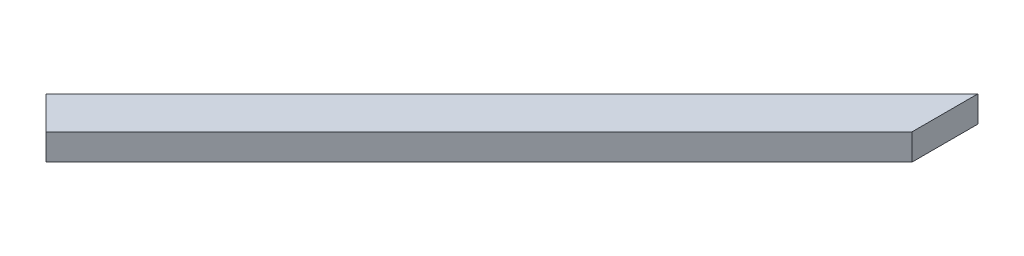
ISO-10303-21;
HEADER;
FILE_DESCRIPTION(('STEP AP214'),'2;1');
FILE_NAME('part.step','',(''),(''),'','','');
FILE_SCHEMA(('AUTOMOTIVE_DESIGN { 1 0 10303 214 1 1 1 1 }'));
ENDSEC;
DATA;
#1=APPLICATION_CONTEXT('core data for automotive mechanical design processes');
#2=APPLICATION_PROTOCOL_DEFINITION('international standard','automotive_design',2000,#1);
#3=PRODUCT_CONTEXT('',#1,'mechanical');
#4=PRODUCT('Part','Part','',(#3));
#5=PRODUCT_RELATED_PRODUCT_CATEGORY('part','',(#4));
#6=PRODUCT_DEFINITION_FORMATION('','',#4);
#7=PRODUCT_DEFINITION_CONTEXT('part definition',#1,'design');
#8=PRODUCT_DEFINITION('design','',#6,#7);
#9=PRODUCT_DEFINITION_SHAPE('','',#8);
#10=(LENGTH_UNIT() NAMED_UNIT(*) SI_UNIT(.MILLI.,.METRE.));
#11=(NAMED_UNIT(*) PLANE_ANGLE_UNIT() SI_UNIT($,.RADIAN.));
#12=(NAMED_UNIT(*) SI_UNIT($,.STERADIAN.) SOLID_ANGLE_UNIT());
#13=UNCERTAINTY_MEASURE_WITH_UNIT(LENGTH_MEASURE(1.E-05),#10,'distance_accuracy_value','');
#14=(GEOMETRIC_REPRESENTATION_CONTEXT(3) GLOBAL_UNCERTAINTY_ASSIGNED_CONTEXT((#13)) GLOBAL_UNIT_ASSIGNED_CONTEXT((#10,
#11,#12)) REPRESENTATION_CONTEXT('',''));
#15=CARTESIAN_POINT('',(0.,0.,0.));
#16=DIRECTION('',(0.,0.,1.));
#17=DIRECTION('',(1.,0.,0.));
#18=AXIS2_PLACEMENT_3D('',#15,#16,#17);
#19=CARTESIAN_POINT('',(-35.1155,0.,35.1155000000002));
#20=DIRECTION('',(-1.,0.,0.));
#21=DIRECTION('',(0.,0.,1.));
#22=AXIS2_PLACEMENT_3D('',#19,#20,#21);
#23=PLANE('',#22);
#24=DIRECTION('',(0.,1.,0.));
#25=VECTOR('',#24,1.);
#26=CARTESIAN_POINT('',(-35.1155,29.2099999999996,35.1155));
#27=LINE('',#26,#25);
#28=CARTESIAN_POINT('',(-35.1155,0.,35.1155000000002));
#29=VERTEX_POINT('',#28);
#30=CARTESIAN_POINT('',(-35.1155,4.572,35.1155000000001));
#31=VERTEX_POINT('',#30);
#32=EDGE_CURVE('E89',#29,#31,#27,.T.);
#33=ORIENTED_EDGE('',*,*,#32,.T.);
#34=DIRECTION('',(0.,0.,1.));
#35=VECTOR('',#34,1.);
#36=CARTESIAN_POINT('',(-35.1155,4.572,149.86));
#37=LINE('',#36,#35);
#38=CARTESIAN_POINT('',(-35.1155,4.572,46.6461488594529));
#39=VERTEX_POINT('',#38);
#40=EDGE_CURVE('E84',#31,#39,#37,.T.);
#41=ORIENTED_EDGE('',*,*,#40,.T.);
#42=DIRECTION('',(0.,-1.,0.));
#43=VECTOR('',#42,1.);
#44=CARTESIAN_POINT('',(-35.1155,29.2100000000002,46.6461488594529));
#45=LINE('',#44,#43);
#46=CARTESIAN_POINT('',(-35.1155,0.,46.6461488594529));
#47=VERTEX_POINT('',#46);
#48=EDGE_CURVE('E41',#39,#47,#45,.T.);
#49=ORIENTED_EDGE('',*,*,#48,.T.);
#50=DIRECTION('',(0.,0.,-1.));
#51=VECTOR('',#50,1.);
#52=CARTESIAN_POINT('',(-35.1155,0.,-136.622759184095));
#53=LINE('',#52,#51);
#54=EDGE_CURVE('E79',#47,#29,#53,.T.);
#55=ORIENTED_EDGE('',*,*,#54,.T.);
#56=EDGE_LOOP('',(#33,#41,#49,#55));
#57=FACE_BOUND('',#56,.T.);
#58=ADVANCED_FACE('F37',(#57),#23,.F.);
#59=CARTESIAN_POINT('',(-60.3181446143553,0.,-136.622759184095));
#60=DIRECTION('',(0.,-1.,0.));
#61=DIRECTION('',(0.,0.,-1.));
#62=AXIS2_PLACEMENT_3D('',#59,#60,#61);
#63=PLANE('',#62);
#64=ORIENTED_EDGE('',*,*,#54,.F.);
#65=DIRECTION('',(-0.707106781186546,0.,0.707106781186549));
#66=VECTOR('',#65,1.);
#67=CARTESIAN_POINT('',(-16.89356433676,0.,28.4242131962128));
#68=LINE('',#67,#66);
#69=CARTESIAN_POINT('',(-110.557635679511,0.,122.088284538964));
#70=VERTEX_POINT('',#69);
#71=EDGE_CURVE('E61',#47,#70,#68,.T.);
#72=ORIENTED_EDGE('',*,*,#71,.T.);
#73=DIRECTION('',(0.707106781186549,0.,0.707106781186546));
#74=VECTOR('',#73,1.);
#75=CARTESIAN_POINT('',(-116.322960109237,0.,116.322960109238));
#76=LINE('',#75,#74);
#77=CARTESIAN_POINT('',(-116.322960109237,0.,116.322960109238));
#78=VERTEX_POINT('',#77);
#79=EDGE_CURVE('E46',#78,#70,#76,.T.);
#80=ORIENTED_EDGE('',*,*,#79,.F.);
#81=DIRECTION('',(-0.707106781186546,0.,0.707106781186549));
#82=VECTOR('',#81,1.);
#83=CARTESIAN_POINT('',(-22.6588887664864,0.,22.6588887664865));
#84=LINE('',#83,#82);
#85=EDGE_CURVE('E54',#29,#78,#84,.T.);
#86=ORIENTED_EDGE('',*,*,#85,.F.);
#87=EDGE_LOOP('',(#64,#72,#80,#86));
#88=FACE_BOUND('',#87,.T.);
#89=ADVANCED_FACE('F39',(#88),#63,.T.);
#90=CARTESIAN_POINT('',(-116.322960109237,0.,116.322960109238));
#91=DIRECTION('',(0.707106781186546,0.,-0.707106781186549));
#92=DIRECTION('',(-0.707106781186549,0.,-0.707106781186546));
#93=AXIS2_PLACEMENT_3D('',#90,#91,#92);
#94=PLANE('',#93);
#95=DIRECTION('',(0.,-1.,0.));
#96=VECTOR('',#95,1.);
#97=CARTESIAN_POINT('',(-116.322960109237,0.,116.322960109238));
#98=LINE('',#97,#96);
#99=CARTESIAN_POINT('',(-116.322960109237,4.572,116.322960109238));
#100=VERTEX_POINT('',#99);
#101=EDGE_CURVE('E11',#100,#78,#98,.T.);
#102=ORIENTED_EDGE('',*,*,#101,.T.);
#103=ORIENTED_EDGE('',*,*,#79,.T.);
#104=DIRECTION('',(0.,1.,0.));
#105=VECTOR('',#104,1.);
#106=CARTESIAN_POINT('',(-110.557635679511,0.,122.088284538964));
#107=LINE('',#106,#105);
#108=CARTESIAN_POINT('',(-110.557635679511,4.572,122.088284538964));
#109=VERTEX_POINT('',#108);
#110=EDGE_CURVE('E93',#70,#109,#107,.T.);
#111=ORIENTED_EDGE('',*,*,#110,.T.);
#112=DIRECTION('',(-0.707106781186549,0.,-0.707106781186546));
#113=VECTOR('',#112,1.);
#114=CARTESIAN_POINT('',(-116.322960109237,4.572,116.322960109238));
#115=LINE('',#114,#113);
#116=EDGE_CURVE('E96',#109,#100,#115,.T.);
#117=ORIENTED_EDGE('',*,*,#116,.T.);
#118=EDGE_LOOP('',(#102,#103,#111,#117));
#119=FACE_BOUND('',#118,.T.);
#120=ADVANCED_FACE('F111',(#119),#94,.F.);
#121=CARTESIAN_POINT('',(-22.6588887664864,4.572,22.6588887664864));
#122=DIRECTION('',(0.,1.,0.));
#123=DIRECTION('',(0.,0.,1.));
#124=AXIS2_PLACEMENT_3D('',#121,#122,#123);
#125=PLANE('',#124);
#126=ORIENTED_EDGE('',*,*,#40,.F.);
#127=DIRECTION('',(-0.707106781186546,0.,0.707106781186549));
#128=VECTOR('',#127,1.);
#129=CARTESIAN_POINT('',(-22.6588887664864,4.572,22.6588887664864));
#130=LINE('',#129,#128);
#131=EDGE_CURVE('E83',#31,#100,#130,.T.);
#132=ORIENTED_EDGE('',*,*,#131,.T.);
#133=ORIENTED_EDGE('',*,*,#116,.F.);
#134=DIRECTION('',(-0.707106781186546,0.,0.707106781186549));
#135=VECTOR('',#134,1.);
#136=CARTESIAN_POINT('',(-16.89356433676,4.572,28.4242131962128));
#137=LINE('',#136,#135);
#138=EDGE_CURVE('E94',#39,#109,#137,.T.);
#139=ORIENTED_EDGE('',*,*,#138,.F.);
#140=EDGE_LOOP('',(#126,#132,#133,#139));
#141=FACE_BOUND('',#140,.T.);
#142=ADVANCED_FACE('F109',(#141),#125,.T.);
#143=CARTESIAN_POINT('',(-16.89356433676,0.,28.4242131962128));
#144=DIRECTION('',(0.707106781186549,0.,0.707106781186546));
#145=DIRECTION('',(0.707106781186546,0.,-0.707106781186549));
#146=AXIS2_PLACEMENT_3D('',#143,#144,#145);
#147=PLANE('',#146);
#148=ORIENTED_EDGE('',*,*,#48,.F.);
#149=ORIENTED_EDGE('',*,*,#138,.T.);
#150=ORIENTED_EDGE('',*,*,#110,.F.);
#151=ORIENTED_EDGE('',*,*,#71,.F.);
#152=EDGE_LOOP('',(#148,#149,#150,#151));
#153=FACE_BOUND('',#152,.T.);
#154=ADVANCED_FACE('F91',(#153),#147,.T.);
#155=CARTESIAN_POINT('',(-22.6588887664864,0.,22.6588887664865));
#156=DIRECTION('',(-0.707106781186549,0.,-0.707106781186546));
#157=DIRECTION('',(-0.707106781186546,0.,0.707106781186549));
#158=AXIS2_PLACEMENT_3D('',#155,#156,#157);
#159=PLANE('',#158);
#160=ORIENTED_EDGE('',*,*,#32,.F.);
#161=ORIENTED_EDGE('',*,*,#85,.T.);
#162=ORIENTED_EDGE('',*,*,#101,.F.);
#163=ORIENTED_EDGE('',*,*,#131,.F.);
#164=EDGE_LOOP('',(#160,#161,#162,#163));
#165=FACE_BOUND('',#164,.T.);
#166=ADVANCED_FACE('F106',(#165),#159,.T.);
#167=CLOSED_SHELL('',(#58,#89,#120,#142,#154,#166));
#168=MANIFOLD_SOLID_BREP('B2',#167);
#169=ADVANCED_BREP_SHAPE_REPRESENTATION('',(#18,#168),#14);
#170=SHAPE_DEFINITION_REPRESENTATION(#9,#169);
ENDSEC;
END-ISO-10303-21;
